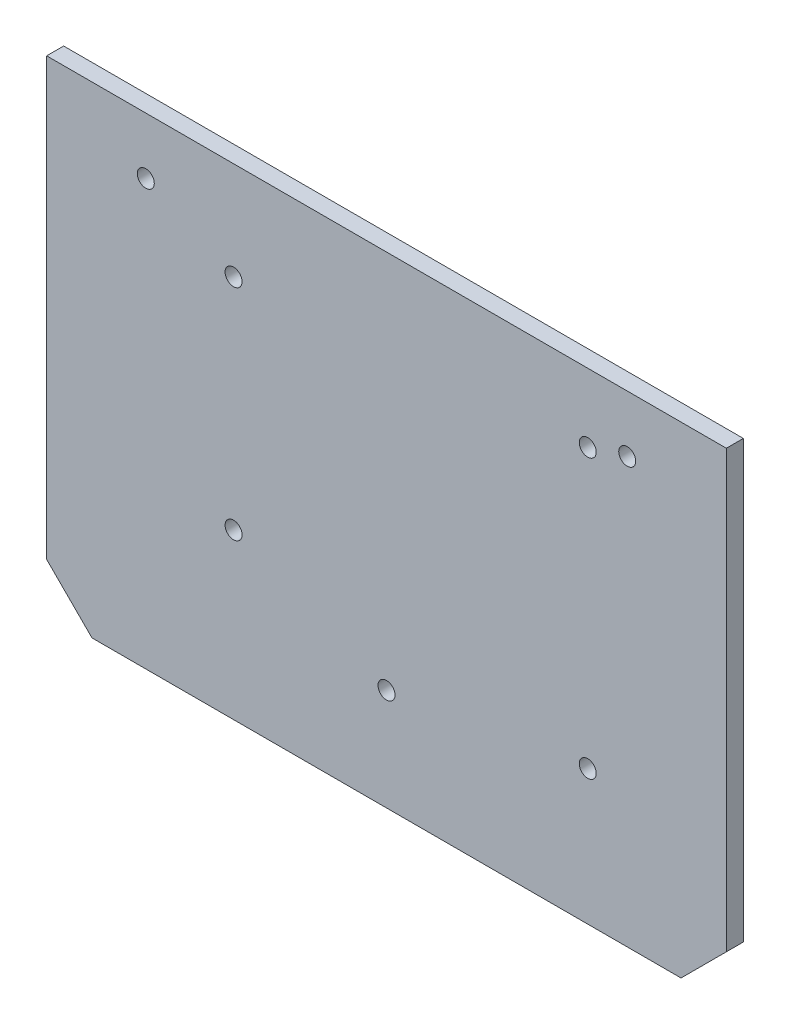
ISO-10303-21;
HEADER;
FILE_DESCRIPTION(('STEP AP214'),'2;1');
FILE_NAME('part.step','',(''),(''),'','','');
FILE_SCHEMA(('AUTOMOTIVE_DESIGN { 1 0 10303 214 1 1 1 1 }'));
ENDSEC;
DATA;
#1=APPLICATION_CONTEXT('core data for automotive mechanical design processes');
#2=APPLICATION_PROTOCOL_DEFINITION('international standard','automotive_design',2000,#1);
#3=PRODUCT_CONTEXT('',#1,'mechanical');
#4=PRODUCT('Part','Part','',(#3));
#5=PRODUCT_RELATED_PRODUCT_CATEGORY('part','',(#4));
#6=PRODUCT_DEFINITION_FORMATION('','',#4);
#7=PRODUCT_DEFINITION_CONTEXT('part definition',#1,'design');
#8=PRODUCT_DEFINITION('design','',#6,#7);
#9=PRODUCT_DEFINITION_SHAPE('','',#8);
#10=(LENGTH_UNIT() NAMED_UNIT(*) SI_UNIT(.MILLI.,.METRE.));
#11=(NAMED_UNIT(*) PLANE_ANGLE_UNIT() SI_UNIT($,.RADIAN.));
#12=(NAMED_UNIT(*) SI_UNIT($,.STERADIAN.) SOLID_ANGLE_UNIT());
#13=UNCERTAINTY_MEASURE_WITH_UNIT(LENGTH_MEASURE(1.E-05),#10,'distance_accuracy_value','');
#14=(GEOMETRIC_REPRESENTATION_CONTEXT(3) GLOBAL_UNCERTAINTY_ASSIGNED_CONTEXT((#13)) GLOBAL_UNIT_ASSIGNED_CONTEXT((#10,
#11,#12)) REPRESENTATION_CONTEXT('',''));
#15=CARTESIAN_POINT('',(0.,0.,0.));
#16=DIRECTION('',(0.,0.,1.));
#17=DIRECTION('',(1.,0.,0.));
#18=AXIS2_PLACEMENT_3D('',#15,#16,#17);
#19=CARTESIAN_POINT('',(60.,42.5,3.));
#20=DIRECTION('',(-1.,0.,0.));
#21=DIRECTION('',(0.,-1.,0.));
#22=AXIS2_PLACEMENT_3D('',#19,#20,#21);
#23=PLANE('',#22);
#24=DIRECTION('',(0.,1.,0.));
#25=VECTOR('',#24,1.);
#26=CARTESIAN_POINT('',(60.,42.5,3.));
#27=LINE('',#26,#25);
#28=CARTESIAN_POINT('',(60.,-34.5,3.));
#29=VERTEX_POINT('',#28);
#30=CARTESIAN_POINT('',(60.,42.5,3.));
#31=VERTEX_POINT('',#30);
#32=EDGE_CURVE('E91',#29,#31,#27,.T.);
#33=ORIENTED_EDGE('',*,*,#32,.F.);
#34=DIRECTION('',(0.,0.,-1.));
#35=VECTOR('',#34,1.);
#36=CARTESIAN_POINT('',(60.,-34.5,3.));
#37=LINE('',#36,#35);
#38=CARTESIAN_POINT('',(60.,-34.5,0.));
#39=VERTEX_POINT('',#38);
#40=EDGE_CURVE('E114',#29,#39,#37,.T.);
#41=ORIENTED_EDGE('',*,*,#40,.T.);
#42=DIRECTION('',(0.,1.,0.));
#43=VECTOR('',#42,1.);
#44=CARTESIAN_POINT('',(60.,42.5,0.));
#45=LINE('',#44,#43);
#46=CARTESIAN_POINT('',(60.,42.5,0.));
#47=VERTEX_POINT('',#46);
#48=EDGE_CURVE('E112',#39,#47,#45,.T.);
#49=ORIENTED_EDGE('',*,*,#48,.T.);
#50=DIRECTION('',(0.,0.,-1.));
#51=VECTOR('',#50,1.);
#52=CARTESIAN_POINT('',(60.,42.5,3.));
#53=LINE('',#52,#51);
#54=EDGE_CURVE('E106',#31,#47,#53,.T.);
#55=ORIENTED_EDGE('',*,*,#54,.F.);
#56=EDGE_LOOP('',(#33,#41,#49,#55));
#57=FACE_BOUND('',#56,.T.);
#58=ADVANCED_FACE('F37',(#57),#23,.F.);
#59=CARTESIAN_POINT('',(-60.,42.5,3.));
#60=DIRECTION('',(0.,-1.,0.));
#61=DIRECTION('',(0.,0.,-1.));
#62=AXIS2_PLACEMENT_3D('',#59,#60,#61);
#63=PLANE('',#62);
#64=DIRECTION('',(-1.,0.,0.));
#65=VECTOR('',#64,1.);
#66=CARTESIAN_POINT('',(-60.,42.5,0.));
#67=LINE('',#66,#65);
#68=CARTESIAN_POINT('',(-60.,42.5,0.));
#69=VERTEX_POINT('',#68);
#70=EDGE_CURVE('E141',#47,#69,#67,.T.);
#71=ORIENTED_EDGE('',*,*,#70,.T.);
#72=DIRECTION('',(0.,0.,-1.));
#73=VECTOR('',#72,1.);
#74=CARTESIAN_POINT('',(-60.,42.5,3.));
#75=LINE('',#74,#73);
#76=CARTESIAN_POINT('',(-60.,42.5,3.));
#77=VERTEX_POINT('',#76);
#78=EDGE_CURVE('E108',#77,#69,#75,.T.);
#79=ORIENTED_EDGE('',*,*,#78,.F.);
#80=DIRECTION('',(-1.,0.,0.));
#81=VECTOR('',#80,1.);
#82=CARTESIAN_POINT('',(-60.,42.5,3.));
#83=LINE('',#82,#81);
#84=EDGE_CURVE('E94',#31,#77,#83,.T.);
#85=ORIENTED_EDGE('',*,*,#84,.F.);
#86=ORIENTED_EDGE('',*,*,#54,.T.);
#87=EDGE_LOOP('',(#71,#79,#85,#86));
#88=FACE_BOUND('',#87,.T.);
#89=ADVANCED_FACE('F105',(#88),#63,.F.);
#90=CARTESIAN_POINT('',(-60.,42.5,3.));
#91=DIRECTION('',(1.,0.,0.));
#92=DIRECTION('',(0.,1.,0.));
#93=AXIS2_PLACEMENT_3D('',#90,#91,#92);
#94=PLANE('',#93);
#95=DIRECTION('',(0.,-1.,0.));
#96=VECTOR('',#95,1.);
#97=CARTESIAN_POINT('',(-60.,42.5,0.));
#98=LINE('',#97,#96);
#99=CARTESIAN_POINT('',(-60.,-34.5,0.));
#100=VERTEX_POINT('',#99);
#101=EDGE_CURVE('E139',#69,#100,#98,.T.);
#102=ORIENTED_EDGE('',*,*,#101,.T.);
#103=DIRECTION('',(0.,0.,1.));
#104=VECTOR('',#103,1.);
#105=CARTESIAN_POINT('',(-60.,-34.5,3.));
#106=LINE('',#105,#104);
#107=CARTESIAN_POINT('',(-60.,-34.5,3.));
#108=VERTEX_POINT('',#107);
#109=EDGE_CURVE('E11',#100,#108,#106,.T.);
#110=ORIENTED_EDGE('',*,*,#109,.T.);
#111=DIRECTION('',(0.,-1.,0.));
#112=VECTOR('',#111,1.);
#113=CARTESIAN_POINT('',(-60.,42.5,3.));
#114=LINE('',#113,#112);
#115=EDGE_CURVE('E109',#77,#108,#114,.T.);
#116=ORIENTED_EDGE('',*,*,#115,.F.);
#117=ORIENTED_EDGE('',*,*,#78,.T.);
#118=EDGE_LOOP('',(#102,#110,#116,#117));
#119=FACE_BOUND('',#118,.T.);
#120=ADVANCED_FACE('F140',(#119),#94,.F.);
#121=CARTESIAN_POINT('',(-60.,-42.5,3.));
#122=DIRECTION('',(0.,1.,0.));
#123=DIRECTION('',(0.,0.,1.));
#124=AXIS2_PLACEMENT_3D('',#121,#122,#123);
#125=PLANE('',#124);
#126=DIRECTION('',(1.,0.,0.));
#127=VECTOR('',#126,1.);
#128=CARTESIAN_POINT('',(-60.,-42.5,0.));
#129=LINE('',#128,#127);
#130=CARTESIAN_POINT('',(-52.,-42.5,0.));
#131=VERTEX_POINT('',#130);
#132=CARTESIAN_POINT('',(52.,-42.5,0.));
#133=VERTEX_POINT('',#132);
#134=EDGE_CURVE('E101',#131,#133,#129,.T.);
#135=ORIENTED_EDGE('',*,*,#134,.T.);
#136=DIRECTION('',(0.,0.,1.));
#137=VECTOR('',#136,1.);
#138=CARTESIAN_POINT('',(52.,-42.5,3.));
#139=LINE('',#138,#137);
#140=CARTESIAN_POINT('',(52.,-42.5,3.));
#141=VERTEX_POINT('',#140);
#142=EDGE_CURVE('E58',#133,#141,#139,.T.);
#143=ORIENTED_EDGE('',*,*,#142,.T.);
#144=DIRECTION('',(1.,0.,0.));
#145=VECTOR('',#144,1.);
#146=CARTESIAN_POINT('',(-60.,-42.5,3.));
#147=LINE('',#146,#145);
#148=CARTESIAN_POINT('',(-52.,-42.5,3.));
#149=VERTEX_POINT('',#148);
#150=EDGE_CURVE('E118',#149,#141,#147,.T.);
#151=ORIENTED_EDGE('',*,*,#150,.F.);
#152=DIRECTION('',(0.,0.,-1.));
#153=VECTOR('',#152,1.);
#154=CARTESIAN_POINT('',(-52.,-42.5,3.));
#155=LINE('',#154,#153);
#156=EDGE_CURVE('E125',#149,#131,#155,.T.);
#157=ORIENTED_EDGE('',*,*,#156,.T.);
#158=EDGE_LOOP('',(#135,#143,#151,#157));
#159=FACE_BOUND('',#158,.T.);
#160=ADVANCED_FACE('F133',(#159),#125,.F.);
#161=CARTESIAN_POINT('',(0.,0.,3.));
#162=DIRECTION('',(0.,0.,1.));
#163=DIRECTION('',(1.,0.,0.));
#164=AXIS2_PLACEMENT_3D('',#161,#162,#163);
#165=PLANE('',#164);
#166=CARTESIAN_POINT('',(-27.,25.2,3.));
#167=DIRECTION('',(0.,0.,1.));
#168=DIRECTION('',(1.,0.,0.));
#169=AXIS2_PLACEMENT_3D('',#166,#167,#168);
#170=CIRCLE('',#169,1.5);
#171=CARTESIAN_POINT('',(-25.5,25.2,3.));
#172=VERTEX_POINT('',#171);
#173=EDGE_CURVE('E184',#172,#172,#170,.T.);
#174=ORIENTED_EDGE('',*,*,#173,.F.);
#175=EDGE_LOOP('',(#174));
#176=FACE_BOUND('',#175,.T.);
#177=CARTESIAN_POINT('',(35.5279937308083,-18.7,3.));
#178=DIRECTION('',(0.,0.,1.));
#179=DIRECTION('',(-1.,0.,0.));
#180=AXIS2_PLACEMENT_3D('',#177,#178,#179);
#181=CIRCLE('',#180,1.5);
#182=CARTESIAN_POINT('',(34.0279937308083,-18.7,3.));
#183=VERTEX_POINT('',#182);
#184=EDGE_CURVE('E178',#183,#183,#181,.T.);
#185=ORIENTED_EDGE('',*,*,#184,.F.);
#186=EDGE_LOOP('',(#185));
#187=FACE_BOUND('',#186,.T.);
#188=CARTESIAN_POINT('',(-27.,-13.5,3.));
#189=DIRECTION('',(0.,0.,1.));
#190=DIRECTION('',(-1.,0.,0.));
#191=AXIS2_PLACEMENT_3D('',#188,#189,#190);
#192=CIRCLE('',#191,1.5);
#193=CARTESIAN_POINT('',(-28.5,-13.5,3.));
#194=VERTEX_POINT('',#193);
#195=EDGE_CURVE('E172',#194,#194,#192,.T.);
#196=ORIENTED_EDGE('',*,*,#195,.F.);
#197=EDGE_LOOP('',(#196));
#198=FACE_BOUND('',#197,.T.);
#199=CARTESIAN_POINT('',(35.5279937308083,30.4,3.));
#200=DIRECTION('',(0.,0.,1.));
#201=DIRECTION('',(1.,0.,0.));
#202=AXIS2_PLACEMENT_3D('',#199,#200,#201);
#203=CIRCLE('',#202,1.5);
#204=CARTESIAN_POINT('',(37.0279937308083,30.4,3.));
#205=VERTEX_POINT('',#204);
#206=EDGE_CURVE('E166',#205,#205,#203,.T.);
#207=ORIENTED_EDGE('',*,*,#206,.F.);
#208=EDGE_LOOP('',(#207));
#209=FACE_BOUND('',#208,.T.);
#210=CARTESIAN_POINT('',(0.,-24.5,3.));
#211=DIRECTION('',(0.,0.,1.));
#212=DIRECTION('',(1.,0.,0.));
#213=AXIS2_PLACEMENT_3D('',#210,#211,#212);
#214=CIRCLE('',#213,1.5);
#215=CARTESIAN_POINT('',(1.50000000000001,-24.5,3.));
#216=VERTEX_POINT('',#215);
#217=EDGE_CURVE('E161',#216,#216,#214,.T.);
#218=ORIENTED_EDGE('',*,*,#217,.F.);
#219=EDGE_LOOP('',(#218));
#220=FACE_BOUND('',#219,.T.);
#221=CARTESIAN_POINT('',(42.5,32.5,3.));
#222=DIRECTION('',(0.,0.,1.));
#223=DIRECTION('',(-1.,0.,0.));
#224=AXIS2_PLACEMENT_3D('',#221,#222,#223);
#225=CIRCLE('',#224,1.5);
#226=CARTESIAN_POINT('',(41.,32.5,3.));
#227=VERTEX_POINT('',#226);
#228=EDGE_CURVE('E154',#227,#227,#225,.T.);
#229=ORIENTED_EDGE('',*,*,#228,.F.);
#230=EDGE_LOOP('',(#229));
#231=FACE_BOUND('',#230,.T.);
#232=CARTESIAN_POINT('',(-42.5,32.5,3.));
#233=DIRECTION('',(0.,0.,1.));
#234=DIRECTION('',(1.,0.,0.));
#235=AXIS2_PLACEMENT_3D('',#232,#233,#234);
#236=CIRCLE('',#235,1.5);
#237=CARTESIAN_POINT('',(-41.,32.5,3.));
#238=VERTEX_POINT('',#237);
#239=EDGE_CURVE('E148',#238,#238,#236,.T.);
#240=ORIENTED_EDGE('',*,*,#239,.F.);
#241=EDGE_LOOP('',(#240));
#242=FACE_BOUND('',#241,.T.);
#243=ORIENTED_EDGE('',*,*,#150,.T.);
#244=DIRECTION('',(-0.707106781186549,-0.707106781186546,0.));
#245=VECTOR('',#244,1.);
#246=CARTESIAN_POINT('',(47.2499999999999,-47.2500000000001,3.));
#247=LINE('',#246,#245);
#248=EDGE_CURVE('E45',#141,#29,#247,.F.);
#249=ORIENTED_EDGE('',*,*,#248,.T.);
#250=ORIENTED_EDGE('',*,*,#32,.T.);
#251=ORIENTED_EDGE('',*,*,#84,.T.);
#252=ORIENTED_EDGE('',*,*,#115,.T.);
#253=DIRECTION('',(-0.707106781186546,0.707106781186549,0.));
#254=VECTOR('',#253,1.);
#255=CARTESIAN_POINT('',(-47.2500000000001,-47.2499999999999,3.));
#256=LINE('',#255,#254);
#257=EDGE_CURVE('E129',#108,#149,#256,.F.);
#258=ORIENTED_EDGE('',*,*,#257,.T.);
#259=EDGE_LOOP('',(#243,#249,#250,#251,#252,#258));
#260=FACE_BOUND('',#259,.T.);
#261=ADVANCED_FACE('F93',(#176,#187,#198,#209,#220,#231,#242,#260),#165,.T.);
#262=CARTESIAN_POINT('',(0.,0.,0.));
#263=DIRECTION('',(0.,0.,1.));
#264=DIRECTION('',(1.,0.,0.));
#265=AXIS2_PLACEMENT_3D('',#262,#263,#264);
#266=PLANE('',#265);
#267=CARTESIAN_POINT('',(-27.,25.2,0.));
#268=DIRECTION('',(0.,0.,1.));
#269=DIRECTION('',(1.,0.,0.));
#270=AXIS2_PLACEMENT_3D('',#267,#268,#269);
#271=CIRCLE('',#270,1.5);
#272=CARTESIAN_POINT('',(-25.5,25.2,0.));
#273=VERTEX_POINT('',#272);
#274=EDGE_CURVE('E169',#273,#273,#271,.T.);
#275=ORIENTED_EDGE('',*,*,#274,.T.);
#276=EDGE_LOOP('',(#275));
#277=FACE_BOUND('',#276,.T.);
#278=CARTESIAN_POINT('',(35.5279937308083,-18.7,0.));
#279=DIRECTION('',(0.,0.,1.));
#280=DIRECTION('',(-1.,0.,0.));
#281=AXIS2_PLACEMENT_3D('',#278,#279,#280);
#282=CIRCLE('',#281,1.5);
#283=CARTESIAN_POINT('',(34.0279937308083,-18.7,0.));
#284=VERTEX_POINT('',#283);
#285=EDGE_CURVE('E181',#284,#284,#282,.T.);
#286=ORIENTED_EDGE('',*,*,#285,.T.);
#287=EDGE_LOOP('',(#286));
#288=FACE_BOUND('',#287,.T.);
#289=CARTESIAN_POINT('',(-27.,-13.5,0.));
#290=DIRECTION('',(0.,0.,1.));
#291=DIRECTION('',(-1.,0.,0.));
#292=AXIS2_PLACEMENT_3D('',#289,#290,#291);
#293=CIRCLE('',#292,1.5);
#294=CARTESIAN_POINT('',(-28.5,-13.5,0.));
#295=VERTEX_POINT('',#294);
#296=EDGE_CURVE('E175',#295,#295,#293,.T.);
#297=ORIENTED_EDGE('',*,*,#296,.T.);
#298=EDGE_LOOP('',(#297));
#299=FACE_BOUND('',#298,.T.);
#300=CARTESIAN_POINT('',(35.5279937308083,30.4,0.));
#301=DIRECTION('',(0.,0.,1.));
#302=DIRECTION('',(1.,0.,0.));
#303=AXIS2_PLACEMENT_3D('',#300,#301,#302);
#304=CIRCLE('',#303,1.5);
#305=CARTESIAN_POINT('',(37.0279937308083,30.4,0.));
#306=VERTEX_POINT('',#305);
#307=EDGE_CURVE('E158',#306,#306,#304,.T.);
#308=ORIENTED_EDGE('',*,*,#307,.T.);
#309=EDGE_LOOP('',(#308));
#310=FACE_BOUND('',#309,.T.);
#311=CARTESIAN_POINT('',(0.,-24.5,0.));
#312=DIRECTION('',(0.,0.,1.));
#313=DIRECTION('',(1.,0.,0.));
#314=AXIS2_PLACEMENT_3D('',#311,#312,#313);
#315=CIRCLE('',#314,1.5);
#316=CARTESIAN_POINT('',(1.50000000000001,-24.5,0.));
#317=VERTEX_POINT('',#316);
#318=EDGE_CURVE('E151',#317,#317,#315,.T.);
#319=ORIENTED_EDGE('',*,*,#318,.T.);
#320=EDGE_LOOP('',(#319));
#321=FACE_BOUND('',#320,.T.);
#322=CARTESIAN_POINT('',(42.5,32.5,0.));
#323=DIRECTION('',(0.,0.,1.));
#324=DIRECTION('',(-1.,0.,0.));
#325=AXIS2_PLACEMENT_3D('',#322,#323,#324);
#326=CIRCLE('',#325,1.5);
#327=CARTESIAN_POINT('',(41.,32.5,0.));
#328=VERTEX_POINT('',#327);
#329=EDGE_CURVE('E157',#328,#328,#326,.T.);
#330=ORIENTED_EDGE('',*,*,#329,.T.);
#331=EDGE_LOOP('',(#330));
#332=FACE_BOUND('',#331,.T.);
#333=CARTESIAN_POINT('',(-42.5,32.5,0.));
#334=DIRECTION('',(0.,0.,1.));
#335=DIRECTION('',(1.,0.,0.));
#336=AXIS2_PLACEMENT_3D('',#333,#334,#335);
#337=CIRCLE('',#336,1.5);
#338=CARTESIAN_POINT('',(-41.,32.5,0.));
#339=VERTEX_POINT('',#338);
#340=EDGE_CURVE('E145',#339,#339,#337,.T.);
#341=ORIENTED_EDGE('',*,*,#340,.T.);
#342=EDGE_LOOP('',(#341));
#343=FACE_BOUND('',#342,.T.);
#344=ORIENTED_EDGE('',*,*,#48,.F.);
#345=DIRECTION('',(0.707106781186549,0.707106781186546,0.));
#346=VECTOR('',#345,1.);
#347=CARTESIAN_POINT('',(60.,-34.5,0.));
#348=LINE('',#347,#346);
#349=EDGE_CURVE('E123',#39,#133,#348,.F.);
#350=ORIENTED_EDGE('',*,*,#349,.T.);
#351=ORIENTED_EDGE('',*,*,#134,.F.);
#352=DIRECTION('',(0.707106781186546,-0.707106781186549,0.));
#353=VECTOR('',#352,1.);
#354=CARTESIAN_POINT('',(-52.,-42.5,0.));
#355=LINE('',#354,#353);
#356=EDGE_CURVE('E116',#131,#100,#355,.F.);
#357=ORIENTED_EDGE('',*,*,#356,.T.);
#358=ORIENTED_EDGE('',*,*,#101,.F.);
#359=ORIENTED_EDGE('',*,*,#70,.F.);
#360=EDGE_LOOP('',(#344,#350,#351,#357,#358,#359));
#361=FACE_BOUND('',#360,.T.);
#362=ADVANCED_FACE('F138',(#277,#288,#299,#310,#321,#332,#343,#361),#266,.F.);
#363=CARTESIAN_POINT('',(-42.5,32.5,0.));
#364=DIRECTION('',(0.,0.,1.));
#365=DIRECTION('',(1.,0.,0.));
#366=AXIS2_PLACEMENT_3D('',#363,#364,#365);
#367=CYLINDRICAL_SURFACE('',#366,1.5);
#368=ORIENTED_EDGE('',*,*,#340,.F.);
#369=EDGE_LOOP('',(#368));
#370=FACE_BOUND('',#369,.T.);
#371=ORIENTED_EDGE('',*,*,#239,.T.);
#372=EDGE_LOOP('',(#371));
#373=FACE_BOUND('',#372,.T.);
#374=ADVANCED_FACE('F215',(#370,#373),#367,.F.);
#375=CARTESIAN_POINT('',(42.5,32.5,0.));
#376=DIRECTION('',(0.,0.,1.));
#377=DIRECTION('',(1.,0.,0.));
#378=AXIS2_PLACEMENT_3D('',#375,#376,#377);
#379=CYLINDRICAL_SURFACE('',#378,1.5);
#380=ORIENTED_EDGE('',*,*,#329,.F.);
#381=EDGE_LOOP('',(#380));
#382=FACE_BOUND('',#381,.T.);
#383=ORIENTED_EDGE('',*,*,#228,.T.);
#384=EDGE_LOOP('',(#383));
#385=FACE_BOUND('',#384,.T.);
#386=ADVANCED_FACE('F217',(#382,#385),#379,.F.);
#387=CARTESIAN_POINT('',(0.,-24.5,0.));
#388=DIRECTION('',(0.,0.,1.));
#389=DIRECTION('',(1.,0.,0.));
#390=AXIS2_PLACEMENT_3D('',#387,#388,#389);
#391=CYLINDRICAL_SURFACE('',#390,1.5);
#392=ORIENTED_EDGE('',*,*,#318,.F.);
#393=EDGE_LOOP('',(#392));
#394=FACE_BOUND('',#393,.T.);
#395=ORIENTED_EDGE('',*,*,#217,.T.);
#396=EDGE_LOOP('',(#395));
#397=FACE_BOUND('',#396,.T.);
#398=ADVANCED_FACE('F224',(#394,#397),#391,.F.);
#399=CARTESIAN_POINT('',(35.5279937308083,30.4,0.));
#400=DIRECTION('',(0.,0.,1.));
#401=DIRECTION('',(1.,0.,0.));
#402=AXIS2_PLACEMENT_3D('',#399,#400,#401);
#403=CYLINDRICAL_SURFACE('',#402,1.5);
#404=ORIENTED_EDGE('',*,*,#307,.F.);
#405=EDGE_LOOP('',(#404));
#406=FACE_BOUND('',#405,.T.);
#407=ORIENTED_EDGE('',*,*,#206,.T.);
#408=EDGE_LOOP('',(#407));
#409=FACE_BOUND('',#408,.T.);
#410=ADVANCED_FACE('F305',(#406,#409),#403,.F.);
#411=CARTESIAN_POINT('',(-27.,-13.5,0.));
#412=DIRECTION('',(0.,0.,1.));
#413=DIRECTION('',(1.,0.,0.));
#414=AXIS2_PLACEMENT_3D('',#411,#412,#413);
#415=CYLINDRICAL_SURFACE('',#414,1.5);
#416=ORIENTED_EDGE('',*,*,#296,.F.);
#417=EDGE_LOOP('',(#416));
#418=FACE_BOUND('',#417,.T.);
#419=ORIENTED_EDGE('',*,*,#195,.T.);
#420=EDGE_LOOP('',(#419));
#421=FACE_BOUND('',#420,.T.);
#422=ADVANCED_FACE('F295',(#418,#421),#415,.F.);
#423=CARTESIAN_POINT('',(35.5279937308083,-18.7,0.));
#424=DIRECTION('',(0.,0.,1.));
#425=DIRECTION('',(1.,0.,0.));
#426=AXIS2_PLACEMENT_3D('',#423,#424,#425);
#427=CYLINDRICAL_SURFACE('',#426,1.5);
#428=ORIENTED_EDGE('',*,*,#285,.F.);
#429=EDGE_LOOP('',(#428));
#430=FACE_BOUND('',#429,.T.);
#431=ORIENTED_EDGE('',*,*,#184,.T.);
#432=EDGE_LOOP('',(#431));
#433=FACE_BOUND('',#432,.T.);
#434=ADVANCED_FACE('F196',(#430,#433),#427,.F.);
#435=CARTESIAN_POINT('',(-27.,25.2,0.));
#436=DIRECTION('',(0.,0.,1.));
#437=DIRECTION('',(1.,0.,0.));
#438=AXIS2_PLACEMENT_3D('',#435,#436,#437);
#439=CYLINDRICAL_SURFACE('',#438,1.5);
#440=ORIENTED_EDGE('',*,*,#274,.F.);
#441=EDGE_LOOP('',(#440));
#442=FACE_BOUND('',#441,.T.);
#443=ORIENTED_EDGE('',*,*,#173,.T.);
#444=EDGE_LOOP('',(#443));
#445=FACE_BOUND('',#444,.T.);
#446=ADVANCED_FACE('F192',(#442,#445),#439,.F.);
#447=CARTESIAN_POINT('',(60.,-34.5,3.));
#448=DIRECTION('',(-0.707106781186546,0.707106781186549,0.));
#449=DIRECTION('',(0.,0.,-1.));
#450=AXIS2_PLACEMENT_3D('',#447,#448,#449);
#451=PLANE('',#450);
#452=ORIENTED_EDGE('',*,*,#248,.F.);
#453=ORIENTED_EDGE('',*,*,#142,.F.);
#454=ORIENTED_EDGE('',*,*,#349,.F.);
#455=ORIENTED_EDGE('',*,*,#40,.F.);
#456=EDGE_LOOP('',(#452,#453,#454,#455));
#457=FACE_BOUND('',#456,.T.);
#458=ADVANCED_FACE('F195',(#457),#451,.F.);
#459=CARTESIAN_POINT('',(-52.,-42.5,3.));
#460=DIRECTION('',(0.707106781186549,0.707106781186546,0.));
#461=DIRECTION('',(0.,0.,-1.));
#462=AXIS2_PLACEMENT_3D('',#459,#460,#461);
#463=PLANE('',#462);
#464=ORIENTED_EDGE('',*,*,#257,.F.);
#465=ORIENTED_EDGE('',*,*,#109,.F.);
#466=ORIENTED_EDGE('',*,*,#356,.F.);
#467=ORIENTED_EDGE('',*,*,#156,.F.);
#468=EDGE_LOOP('',(#464,#465,#466,#467));
#469=FACE_BOUND('',#468,.T.);
#470=ADVANCED_FACE('F39',(#469),#463,.F.);
#471=CLOSED_SHELL('',(#58,#89,#120,#160,#261,#362,#374,#386,#398,#410,#422,#434,#446,#458,#470));
#472=MANIFOLD_SOLID_BREP('B2',#471);
#473=ADVANCED_BREP_SHAPE_REPRESENTATION('',(#18,#472),#14);
#474=SHAPE_DEFINITION_REPRESENTATION(#9,#473);
ENDSEC;
END-ISO-10303-21;
